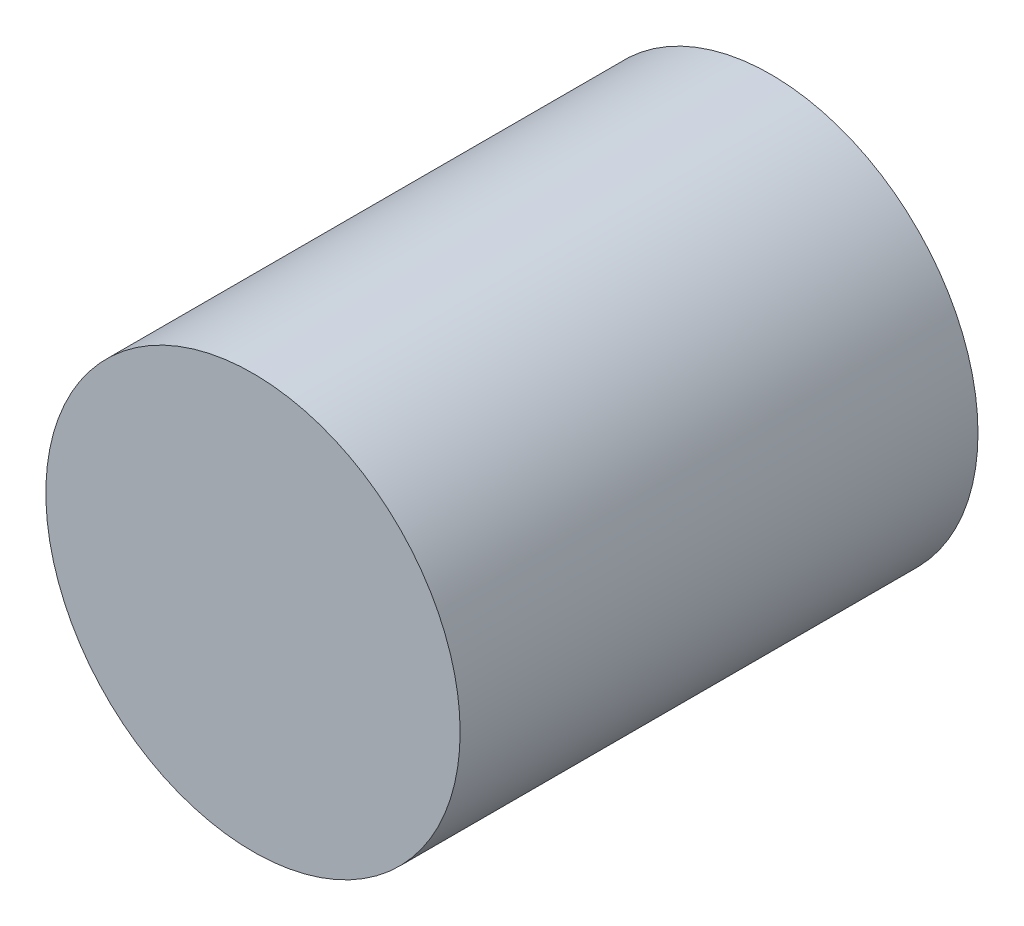
ISO-10303-21;
HEADER;
FILE_DESCRIPTION(('STEP AP214'),'2;1');
FILE_NAME('part.step','',(''),(''),'','','');
FILE_SCHEMA(('AUTOMOTIVE_DESIGN { 1 0 10303 214 1 1 1 1 }'));
ENDSEC;
DATA;
#1=APPLICATION_CONTEXT('core data for automotive mechanical design processes');
#2=APPLICATION_PROTOCOL_DEFINITION('international standard','automotive_design',2000,#1);
#3=PRODUCT_CONTEXT('',#1,'mechanical');
#4=PRODUCT('Part','Part','',(#3));
#5=PRODUCT_RELATED_PRODUCT_CATEGORY('part','',(#4));
#6=PRODUCT_DEFINITION_FORMATION('','',#4);
#7=PRODUCT_DEFINITION_CONTEXT('part definition',#1,'design');
#8=PRODUCT_DEFINITION('design','',#6,#7);
#9=PRODUCT_DEFINITION_SHAPE('','',#8);
#10=(LENGTH_UNIT() NAMED_UNIT(*) SI_UNIT(.MILLI.,.METRE.));
#11=(NAMED_UNIT(*) PLANE_ANGLE_UNIT() SI_UNIT($,.RADIAN.));
#12=(NAMED_UNIT(*) SI_UNIT($,.STERADIAN.) SOLID_ANGLE_UNIT());
#13=UNCERTAINTY_MEASURE_WITH_UNIT(LENGTH_MEASURE(1.E-05),#10,'distance_accuracy_value','');
#14=(GEOMETRIC_REPRESENTATION_CONTEXT(3) GLOBAL_UNCERTAINTY_ASSIGNED_CONTEXT((#13)) GLOBAL_UNIT_ASSIGNED_CONTEXT((#10,
#11,#12)) REPRESENTATION_CONTEXT('',''));
#15=CARTESIAN_POINT('',(0.,0.,0.));
#16=DIRECTION('',(0.,0.,1.));
#17=DIRECTION('',(1.,0.,0.));
#18=AXIS2_PLACEMENT_3D('',#15,#16,#17);
#19=CARTESIAN_POINT('',(0.,0.,50.));
#20=DIRECTION('',(0.,0.,-1.));
#21=DIRECTION('',(-1.,0.,0.));
#22=AXIS2_PLACEMENT_3D('',#19,#20,#21);
#23=CYLINDRICAL_SURFACE('',#22,20.);
#24=CARTESIAN_POINT('',(0.,0.,50.));
#25=DIRECTION('',(0.,0.,1.));
#26=DIRECTION('',(1.,0.,0.));
#27=AXIS2_PLACEMENT_3D('',#24,#25,#26);
#28=CIRCLE('',#27,20.);
#29=CARTESIAN_POINT('',(20.,0.,50.));
#30=VERTEX_POINT('',#29);
#31=EDGE_CURVE('E10',#30,#30,#28,.T.);
#32=ORIENTED_EDGE('',*,*,#31,.F.);
#33=EDGE_LOOP('',(#32));
#34=FACE_BOUND('',#33,.T.);
#35=CARTESIAN_POINT('',(0.,0.,0.));
#36=DIRECTION('',(0.,0.,1.));
#37=DIRECTION('',(1.,0.,0.));
#38=AXIS2_PLACEMENT_3D('',#35,#36,#37);
#39=CIRCLE('',#38,20.);
#40=CARTESIAN_POINT('',(20.,0.,0.));
#41=VERTEX_POINT('',#40);
#42=EDGE_CURVE('E38',#41,#41,#39,.T.);
#43=ORIENTED_EDGE('',*,*,#42,.T.);
#44=EDGE_LOOP('',(#43));
#45=FACE_BOUND('',#44,.T.);
#46=ADVANCED_FACE('F35',(#34,#45),#23,.T.);
#47=CARTESIAN_POINT('',(0.,0.,50.));
#48=DIRECTION('',(0.,0.,1.));
#49=DIRECTION('',(1.,0.,0.));
#50=AXIS2_PLACEMENT_3D('',#47,#48,#49);
#51=PLANE('',#50);
#52=ORIENTED_EDGE('',*,*,#31,.T.);
#53=EDGE_LOOP('',(#52));
#54=FACE_BOUND('',#53,.T.);
#55=ADVANCED_FACE('F50',(#54),#51,.T.);
#56=CARTESIAN_POINT('',(0.,0.,0.));
#57=DIRECTION('',(0.,0.,1.));
#58=DIRECTION('',(1.,0.,0.));
#59=AXIS2_PLACEMENT_3D('',#56,#57,#58);
#60=PLANE('',#59);
#61=ORIENTED_EDGE('',*,*,#42,.F.);
#62=EDGE_LOOP('',(#61));
#63=FACE_BOUND('',#62,.T.);
#64=ADVANCED_FACE('F48',(#63),#60,.F.);
#65=CLOSED_SHELL('',(#46,#55,#64));
#66=MANIFOLD_SOLID_BREP('B2',#65);
#67=ADVANCED_BREP_SHAPE_REPRESENTATION('',(#18,#66),#14);
#68=SHAPE_DEFINITION_REPRESENTATION(#9,#67);
ENDSEC;
END-ISO-10303-21;
